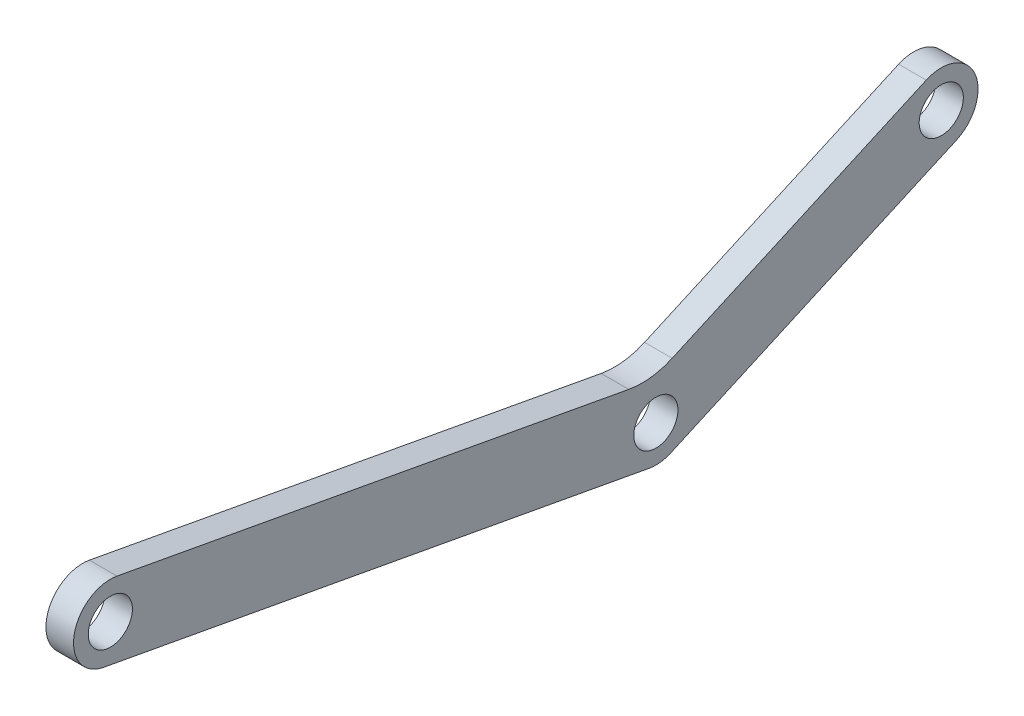
ISO-10303-21;
HEADER;
FILE_DESCRIPTION(('STEP AP214'),'2;1');
FILE_NAME('part.step','',(''),(''),'','','');
FILE_SCHEMA(('AUTOMOTIVE_DESIGN { 1 0 10303 214 1 1 1 1 }'));
ENDSEC;
DATA;
#1=APPLICATION_CONTEXT('core data for automotive mechanical design processes');
#2=APPLICATION_PROTOCOL_DEFINITION('international standard','automotive_design',2000,#1);
#3=PRODUCT_CONTEXT('',#1,'mechanical');
#4=PRODUCT('Part','Part','',(#3));
#5=PRODUCT_RELATED_PRODUCT_CATEGORY('part','',(#4));
#6=PRODUCT_DEFINITION_FORMATION('','',#4);
#7=PRODUCT_DEFINITION_CONTEXT('part definition',#1,'design');
#8=PRODUCT_DEFINITION('design','',#6,#7);
#9=PRODUCT_DEFINITION_SHAPE('','',#8);
#10=(LENGTH_UNIT() NAMED_UNIT(*) SI_UNIT(.MILLI.,.METRE.));
#11=(NAMED_UNIT(*) PLANE_ANGLE_UNIT() SI_UNIT($,.RADIAN.));
#12=(NAMED_UNIT(*) SI_UNIT($,.STERADIAN.) SOLID_ANGLE_UNIT());
#13=UNCERTAINTY_MEASURE_WITH_UNIT(LENGTH_MEASURE(1.E-05),#10,'distance_accuracy_value','');
#14=(GEOMETRIC_REPRESENTATION_CONTEXT(3) GLOBAL_UNCERTAINTY_ASSIGNED_CONTEXT((#13)) GLOBAL_UNIT_ASSIGNED_CONTEXT((#10,
#11,#12)) REPRESENTATION_CONTEXT('',''));
#15=CARTESIAN_POINT('',(0.,0.,0.));
#16=DIRECTION('',(0.,0.,1.));
#17=DIRECTION('',(1.,0.,0.));
#18=AXIS2_PLACEMENT_3D('',#15,#16,#17);
#19=CARTESIAN_POINT('',(-773.875,-73.65,551.64938766));
#20=DIRECTION('',(1.,0.,0.));
#21=DIRECTION('',(0.,0.,-1.));
#22=AXIS2_PLACEMENT_3D('',#19,#20,#21);
#23=PLANE('',#22);
#24=CARTESIAN_POINT('',(-773.875,-128.224072417712,255.133501715319));
#25=DIRECTION('',(1.,0.,0.));
#26=DIRECTION('',(0.,0.,-1.));
#27=AXIS2_PLACEMENT_3D('',#24,#25,#26);
#28=CIRCLE('',#27,12.);
#29=CARTESIAN_POINT('',(-773.875,-128.224072417712,243.133501715318));
#30=VERTEX_POINT('',#29);
#31=EDGE_CURVE('E188',#30,#30,#28,.T.);
#32=ORIENTED_EDGE('',*,*,#31,.F.);
#33=EDGE_LOOP('',(#32));
#34=FACE_BOUND('',#33,.T.);
#35=CARTESIAN_POINT('',(-773.875,-73.65,551.64938766));
#36=DIRECTION('',(1.,0.,0.));
#37=DIRECTION('',(0.,0.,-1.));
#38=AXIS2_PLACEMENT_3D('',#35,#36,#37);
#39=CIRCLE('',#38,20.);
#40=CARTESIAN_POINT('',(-773.875,-53.9803777328953,548.029172214834));
#41=VERTEX_POINT('',#40);
#42=CARTESIAN_POINT('',(-773.875,-93.3196222671047,555.269603105166));
#43=VERTEX_POINT('',#42);
#44=EDGE_CURVE('E151',#41,#43,#39,.T.);
#45=ORIENTED_EDGE('',*,*,#44,.T.);
#46=DIRECTION('',(0.,-0.1810107722583,-0.983481113355236));
#47=VECTOR('',#46,1.);
#48=CARTESIAN_POINT('',(-773.875,-93.3196222671047,555.269603105166));
#49=LINE('',#48,#47);
#50=CARTESIAN_POINT('',(-773.875,-147.893694684817,258.753717160484));
#51=VERTEX_POINT('',#50);
#52=EDGE_CURVE('E99',#43,#51,#49,.T.);
#53=ORIENTED_EDGE('',*,*,#52,.T.);
#54=CARTESIAN_POINT('',(-773.875,-128.224072417712,255.133501715319));
#55=DIRECTION('',(1.,0.,0.));
#56=DIRECTION('',(0.,0.,-1.));
#57=AXIS2_PLACEMENT_3D('',#54,#55,#56);
#58=CIRCLE('',#57,20.);
#59=CARTESIAN_POINT('',(-773.875,-146.475072619514,246.954199077941));
#60=VERTEX_POINT('',#59);
#61=EDGE_CURVE('E166',#51,#60,#58,.T.);
#62=ORIENTED_EDGE('',*,*,#61,.T.);
#63=DIRECTION('',(0.,0.408965131868894,-0.912550010090109));
#64=VECTOR('',#63,1.);
#65=CARTESIAN_POINT('',(-773.875,-76.9510002018022,91.8206973626221));
#66=LINE('',#65,#64);
#67=CARTESIAN_POINT('',(-773.875,-76.9510002018022,91.8206973626221));
#68=VERTEX_POINT('',#67);
#69=EDGE_CURVE('E179',#60,#68,#66,.T.);
#70=ORIENTED_EDGE('',*,*,#69,.T.);
#71=CARTESIAN_POINT('',(-773.875,-58.7,100.));
#72=DIRECTION('',(1.,0.,0.));
#73=DIRECTION('',(0.,0.,-1.));
#74=AXIS2_PLACEMENT_3D('',#71,#72,#73);
#75=CIRCLE('',#74,20.);
#76=CARTESIAN_POINT('',(-773.875,-40.4489997981978,108.179302637378));
#77=VERTEX_POINT('',#76);
#78=EDGE_CURVE('E118',#68,#77,#75,.T.);
#79=ORIENTED_EDGE('',*,*,#78,.T.);
#80=DIRECTION('',(0.,-0.408965131868895,0.912550010090109));
#81=VECTOR('',#80,1.);
#82=CARTESIAN_POINT('',(-773.875,-102.337768012915,246.275662590407));
#83=LINE('',#82,#81);
#84=CARTESIAN_POINT('',(-773.875,-102.337768012915,246.275662590407));
#85=VERTEX_POINT('',#84);
#86=EDGE_CURVE('E112',#77,#85,#83,.T.);
#87=ORIENTED_EDGE('',*,*,#86,.T.);
#88=CARTESIAN_POINT('',(-773.875,-65.8357676093109,262.634267865163));
#89=DIRECTION('',(-1.,0.,0.));
#90=DIRECTION('',(0.,0.,-1.));
#91=AXIS2_PLACEMENT_3D('',#88,#89,#90);
#92=CIRCLE('',#91,40.);
#93=CARTESIAN_POINT('',(-773.875,-105.17501214352,269.874698755495));
#94=VERTEX_POINT('',#93);
#95=EDGE_CURVE('E116',#85,#94,#92,.T.);
#96=ORIENTED_EDGE('',*,*,#95,.T.);
#97=DIRECTION('',(0.,0.1810107722583,0.983481113355236));
#98=VECTOR('',#97,1.);
#99=CARTESIAN_POINT('',(-773.875,-53.9803777328953,548.029172214834));
#100=LINE('',#99,#98);
#101=EDGE_CURVE('E56',#94,#41,#100,.T.);
#102=ORIENTED_EDGE('',*,*,#101,.T.);
#103=EDGE_LOOP('',(#45,#53,#62,#70,#79,#87,#96,#102));
#104=FACE_BOUND('',#103,.T.);
#105=CARTESIAN_POINT('',(-773.875,-58.7,100.));
#106=DIRECTION('',(1.,0.,0.));
#107=DIRECTION('',(0.,0.,-1.));
#108=AXIS2_PLACEMENT_3D('',#105,#106,#107);
#109=CIRCLE('',#108,12.);
#110=CARTESIAN_POINT('',(-773.875,-58.7,88.));
#111=VERTEX_POINT('',#110);
#112=EDGE_CURVE('E140',#111,#111,#109,.T.);
#113=ORIENTED_EDGE('',*,*,#112,.F.);
#114=EDGE_LOOP('',(#113));
#115=FACE_BOUND('',#114,.T.);
#116=CARTESIAN_POINT('',(-773.875,-73.65,551.64938766));
#117=DIRECTION('',(1.,0.,0.));
#118=DIRECTION('',(0.,0.,-1.));
#119=AXIS2_PLACEMENT_3D('',#116,#117,#118);
#120=CIRCLE('',#119,12.0000000000001);
#121=CARTESIAN_POINT('',(-773.875,-73.65,539.64938766));
#122=VERTEX_POINT('',#121);
#123=EDGE_CURVE('E194',#122,#122,#120,.T.);
#124=ORIENTED_EDGE('',*,*,#123,.F.);
#125=EDGE_LOOP('',(#124));
#126=FACE_BOUND('',#125,.T.);
#127=ADVANCED_FACE('F39',(#34,#104,#115,#126),#23,.T.);
#128=CARTESIAN_POINT('',(-788.875,-73.65,551.64938766));
#129=DIRECTION('',(1.,0.,0.));
#130=DIRECTION('',(0.,0.,-1.));
#131=AXIS2_PLACEMENT_3D('',#128,#129,#130);
#132=PLANE('',#131);
#133=CARTESIAN_POINT('',(-788.875,-73.65,551.64938766));
#134=DIRECTION('',(1.,0.,0.));
#135=DIRECTION('',(0.,0.,-1.));
#136=AXIS2_PLACEMENT_3D('',#133,#134,#135);
#137=CIRCLE('',#136,20.);
#138=CARTESIAN_POINT('',(-788.875,-53.9803777328953,548.029172214834));
#139=VERTEX_POINT('',#138);
#140=CARTESIAN_POINT('',(-788.875,-93.3196222671047,555.269603105166));
#141=VERTEX_POINT('',#140);
#142=EDGE_CURVE('E136',#139,#141,#137,.T.);
#143=ORIENTED_EDGE('',*,*,#142,.F.);
#144=DIRECTION('',(0.,0.1810107722583,0.983481113355236));
#145=VECTOR('',#144,1.);
#146=CARTESIAN_POINT('',(-788.875,-53.9803777328953,548.029172214834));
#147=LINE('',#146,#145);
#148=CARTESIAN_POINT('',(-788.875,-105.17501214352,269.874698755495));
#149=VERTEX_POINT('',#148);
#150=EDGE_CURVE('E91',#149,#139,#147,.T.);
#151=ORIENTED_EDGE('',*,*,#150,.F.);
#152=CARTESIAN_POINT('',(-788.875,-65.8357676093109,262.634267865163));
#153=DIRECTION('',(-1.,0.,0.));
#154=DIRECTION('',(0.,0.,-1.));
#155=AXIS2_PLACEMENT_3D('',#152,#153,#154);
#156=CIRCLE('',#155,40.);
#157=CARTESIAN_POINT('',(-788.875,-102.337768012915,246.275662590407));
#158=VERTEX_POINT('',#157);
#159=EDGE_CURVE('E85',#158,#149,#156,.T.);
#160=ORIENTED_EDGE('',*,*,#159,.F.);
#161=DIRECTION('',(0.,-0.408965131868895,0.912550010090109));
#162=VECTOR('',#161,1.);
#163=CARTESIAN_POINT('',(-788.875,-102.337768012915,246.275662590407));
#164=LINE('',#163,#162);
#165=CARTESIAN_POINT('',(-788.875,-40.4489997981978,108.179302637378));
#166=VERTEX_POINT('',#165);
#167=EDGE_CURVE('E126',#166,#158,#164,.T.);
#168=ORIENTED_EDGE('',*,*,#167,.F.);
#169=CARTESIAN_POINT('',(-788.875,-58.7,100.));
#170=DIRECTION('',(1.,0.,0.));
#171=DIRECTION('',(0.,0.,-1.));
#172=AXIS2_PLACEMENT_3D('',#169,#170,#171);
#173=CIRCLE('',#172,20.);
#174=CARTESIAN_POINT('',(-788.875,-76.9510002018022,91.8206973626221));
#175=VERTEX_POINT('',#174);
#176=EDGE_CURVE('E146',#175,#166,#173,.T.);
#177=ORIENTED_EDGE('',*,*,#176,.F.);
#178=DIRECTION('',(0.,0.408965131868894,-0.912550010090109));
#179=VECTOR('',#178,1.);
#180=CARTESIAN_POINT('',(-788.875,-76.9510002018022,91.8206973626221));
#181=LINE('',#180,#179);
#182=CARTESIAN_POINT('',(-788.875,-146.475072619514,246.954199077941));
#183=VERTEX_POINT('',#182);
#184=EDGE_CURVE('E144',#183,#175,#181,.T.);
#185=ORIENTED_EDGE('',*,*,#184,.F.);
#186=CARTESIAN_POINT('',(-788.875,-128.224072417712,255.133501715319));
#187=DIRECTION('',(1.,0.,0.));
#188=DIRECTION('',(0.,0.,-1.));
#189=AXIS2_PLACEMENT_3D('',#186,#187,#188);
#190=CIRCLE('',#189,20.);
#191=CARTESIAN_POINT('',(-788.875,-147.893694684817,258.753717160484));
#192=VERTEX_POINT('',#191);
#193=EDGE_CURVE('E142',#192,#183,#190,.T.);
#194=ORIENTED_EDGE('',*,*,#193,.F.);
#195=DIRECTION('',(0.,-0.1810107722583,-0.983481113355236));
#196=VECTOR('',#195,1.);
#197=CARTESIAN_POINT('',(-788.875,-93.3196222671047,555.269603105166));
#198=LINE('',#197,#196);
#199=EDGE_CURVE('E139',#141,#192,#198,.T.);
#200=ORIENTED_EDGE('',*,*,#199,.F.);
#201=EDGE_LOOP('',(#143,#151,#160,#168,#177,#185,#194,#200));
#202=FACE_BOUND('',#201,.T.);
#203=CARTESIAN_POINT('',(-788.875,-58.7,100.));
#204=DIRECTION('',(1.,0.,0.));
#205=DIRECTION('',(0.,0.,-1.));
#206=AXIS2_PLACEMENT_3D('',#203,#204,#205);
#207=CIRCLE('',#206,12.);
#208=CARTESIAN_POINT('',(-788.875,-58.7,88.));
#209=VERTEX_POINT('',#208);
#210=EDGE_CURVE('E185',#209,#209,#207,.T.);
#211=ORIENTED_EDGE('',*,*,#210,.T.);
#212=EDGE_LOOP('',(#211));
#213=FACE_BOUND('',#212,.T.);
#214=CARTESIAN_POINT('',(-788.875,-128.224072417712,255.133501715319));
#215=DIRECTION('',(1.,0.,0.));
#216=DIRECTION('',(0.,0.,-1.));
#217=AXIS2_PLACEMENT_3D('',#214,#215,#216);
#218=CIRCLE('',#217,12.);
#219=CARTESIAN_POINT('',(-788.875,-128.224072417712,243.133501715318));
#220=VERTEX_POINT('',#219);
#221=EDGE_CURVE('E191',#220,#220,#218,.T.);
#222=ORIENTED_EDGE('',*,*,#221,.T.);
#223=EDGE_LOOP('',(#222));
#224=FACE_BOUND('',#223,.T.);
#225=CARTESIAN_POINT('',(-788.875,-73.65,551.64938766));
#226=DIRECTION('',(1.,0.,0.));
#227=DIRECTION('',(0.,0.,-1.));
#228=AXIS2_PLACEMENT_3D('',#225,#226,#227);
#229=CIRCLE('',#228,12.0000000000001);
#230=CARTESIAN_POINT('',(-788.875,-73.65,539.64938766));
#231=VERTEX_POINT('',#230);
#232=EDGE_CURVE('E197',#231,#231,#229,.T.);
#233=ORIENTED_EDGE('',*,*,#232,.T.);
#234=EDGE_LOOP('',(#233));
#235=FACE_BOUND('',#234,.T.);
#236=ADVANCED_FACE('F170',(#202,#213,#224,#235),#132,.F.);
#237=CARTESIAN_POINT('',(-773.875,-73.65,551.64938766));
#238=DIRECTION('',(-1.,0.,0.));
#239=DIRECTION('',(0.,0.,1.));
#240=AXIS2_PLACEMENT_3D('',#237,#238,#239);
#241=CYLINDRICAL_SURFACE('',#240,20.);
#242=ORIENTED_EDGE('',*,*,#142,.T.);
#243=DIRECTION('',(-1.,0.,0.));
#244=VECTOR('',#243,1.);
#245=CARTESIAN_POINT('',(-773.875,-93.3196222671047,555.269603105166));
#246=LINE('',#245,#244);
#247=EDGE_CURVE('E11',#43,#141,#246,.T.);
#248=ORIENTED_EDGE('',*,*,#247,.F.);
#249=ORIENTED_EDGE('',*,*,#44,.F.);
#250=DIRECTION('',(-1.,0.,0.));
#251=VECTOR('',#250,1.);
#252=CARTESIAN_POINT('',(-773.875,-53.9803777328953,548.029172214834));
#253=LINE('',#252,#251);
#254=EDGE_CURVE('E132',#41,#139,#253,.T.);
#255=ORIENTED_EDGE('',*,*,#254,.T.);
#256=EDGE_LOOP('',(#242,#248,#249,#255));
#257=FACE_BOUND('',#256,.T.);
#258=ADVANCED_FACE('F41',(#257),#241,.T.);
#259=CARTESIAN_POINT('',(-773.875,-93.3196222671047,555.269603105166));
#260=DIRECTION('',(0.,0.983481113355236,-0.1810107722583));
#261=DIRECTION('',(0.,0.1810107722583,0.983481113355236));
#262=AXIS2_PLACEMENT_3D('',#259,#260,#261);
#263=PLANE('',#262);
#264=ORIENTED_EDGE('',*,*,#199,.T.);
#265=DIRECTION('',(-1.,0.,0.));
#266=VECTOR('',#265,1.);
#267=CARTESIAN_POINT('',(-773.875,-147.893694684817,258.753717160484));
#268=LINE('',#267,#266);
#269=EDGE_CURVE('E48',#51,#192,#268,.T.);
#270=ORIENTED_EDGE('',*,*,#269,.F.);
#271=ORIENTED_EDGE('',*,*,#52,.F.);
#272=ORIENTED_EDGE('',*,*,#247,.T.);
#273=EDGE_LOOP('',(#264,#270,#271,#272));
#274=FACE_BOUND('',#273,.T.);
#275=ADVANCED_FACE('F230',(#274),#263,.F.);
#276=CARTESIAN_POINT('',(-773.875,-128.224072417712,255.133501715319));
#277=DIRECTION('',(-1.,0.,0.));
#278=DIRECTION('',(0.,0.,1.));
#279=AXIS2_PLACEMENT_3D('',#276,#277,#278);
#280=CYLINDRICAL_SURFACE('',#279,20.);
#281=ORIENTED_EDGE('',*,*,#193,.T.);
#282=DIRECTION('',(-1.,0.,0.));
#283=VECTOR('',#282,1.);
#284=CARTESIAN_POINT('',(-773.875,-146.475072619514,246.954199077941));
#285=LINE('',#284,#283);
#286=EDGE_CURVE('E158',#60,#183,#285,.T.);
#287=ORIENTED_EDGE('',*,*,#286,.F.);
#288=ORIENTED_EDGE('',*,*,#61,.F.);
#289=ORIENTED_EDGE('',*,*,#269,.T.);
#290=EDGE_LOOP('',(#281,#287,#288,#289));
#291=FACE_BOUND('',#290,.T.);
#292=ADVANCED_FACE('F164',(#291),#280,.T.);
#293=CARTESIAN_POINT('',(-773.875,-76.9510002018022,91.8206973626221));
#294=DIRECTION('',(0.,0.912550010090109,0.408965131868894));
#295=DIRECTION('',(0.,-0.408965131868894,0.912550010090109));
#296=AXIS2_PLACEMENT_3D('',#293,#294,#295);
#297=PLANE('',#296);
#298=ORIENTED_EDGE('',*,*,#184,.T.);
#299=DIRECTION('',(-1.,0.,0.));
#300=VECTOR('',#299,1.);
#301=CARTESIAN_POINT('',(-773.875,-76.9510002018022,91.8206973626221));
#302=LINE('',#301,#300);
#303=EDGE_CURVE('E155',#68,#175,#302,.T.);
#304=ORIENTED_EDGE('',*,*,#303,.F.);
#305=ORIENTED_EDGE('',*,*,#69,.F.);
#306=ORIENTED_EDGE('',*,*,#286,.T.);
#307=EDGE_LOOP('',(#298,#304,#305,#306));
#308=FACE_BOUND('',#307,.T.);
#309=ADVANCED_FACE('F175',(#308),#297,.F.);
#310=CARTESIAN_POINT('',(-773.875,-58.7,100.));
#311=DIRECTION('',(-1.,0.,0.));
#312=DIRECTION('',(0.,0.,1.));
#313=AXIS2_PLACEMENT_3D('',#310,#311,#312);
#314=CYLINDRICAL_SURFACE('',#313,20.);
#315=ORIENTED_EDGE('',*,*,#176,.T.);
#316=DIRECTION('',(-1.,0.,0.));
#317=VECTOR('',#316,1.);
#318=CARTESIAN_POINT('',(-773.875,-40.4489997981978,108.179302637378));
#319=LINE('',#318,#317);
#320=EDGE_CURVE('E127',#77,#166,#319,.T.);
#321=ORIENTED_EDGE('',*,*,#320,.F.);
#322=ORIENTED_EDGE('',*,*,#78,.F.);
#323=ORIENTED_EDGE('',*,*,#303,.T.);
#324=EDGE_LOOP('',(#315,#321,#322,#323));
#325=FACE_BOUND('',#324,.T.);
#326=ADVANCED_FACE('F178',(#325),#314,.T.);
#327=CARTESIAN_POINT('',(-773.875,-102.337768012915,246.275662590407));
#328=DIRECTION('',(0.,-0.912550010090109,-0.408965131868895));
#329=DIRECTION('',(0.,0.408965131868895,-0.912550010090109));
#330=AXIS2_PLACEMENT_3D('',#327,#328,#329);
#331=PLANE('',#330);
#332=ORIENTED_EDGE('',*,*,#167,.T.);
#333=DIRECTION('',(-1.,0.,0.));
#334=VECTOR('',#333,1.);
#335=CARTESIAN_POINT('',(-773.875,-102.337768012915,246.275662590407));
#336=LINE('',#335,#334);
#337=EDGE_CURVE('E123',#85,#158,#336,.T.);
#338=ORIENTED_EDGE('',*,*,#337,.F.);
#339=ORIENTED_EDGE('',*,*,#86,.F.);
#340=ORIENTED_EDGE('',*,*,#320,.T.);
#341=EDGE_LOOP('',(#332,#338,#339,#340));
#342=FACE_BOUND('',#341,.T.);
#343=ADVANCED_FACE('F124',(#342),#331,.F.);
#344=CARTESIAN_POINT('',(-773.875,-65.8357676093109,262.634267865163));
#345=DIRECTION('',(-1.,0.,0.));
#346=DIRECTION('',(0.,0.,1.));
#347=AXIS2_PLACEMENT_3D('',#344,#345,#346);
#348=CYLINDRICAL_SURFACE('',#347,40.);
#349=ORIENTED_EDGE('',*,*,#159,.T.);
#350=DIRECTION('',(-1.,0.,0.));
#351=VECTOR('',#350,1.);
#352=CARTESIAN_POINT('',(-773.875,-105.17501214352,269.874698755495));
#353=LINE('',#352,#351);
#354=EDGE_CURVE('E128',#94,#149,#353,.T.);
#355=ORIENTED_EDGE('',*,*,#354,.F.);
#356=ORIENTED_EDGE('',*,*,#95,.F.);
#357=ORIENTED_EDGE('',*,*,#337,.T.);
#358=EDGE_LOOP('',(#349,#355,#356,#357));
#359=FACE_BOUND('',#358,.T.);
#360=ADVANCED_FACE('F130',(#359),#348,.F.);
#361=CARTESIAN_POINT('',(-773.875,-53.9803777328953,548.029172214834));
#362=DIRECTION('',(0.,-0.983481113355236,0.1810107722583));
#363=DIRECTION('',(0.,-0.1810107722583,-0.983481113355236));
#364=AXIS2_PLACEMENT_3D('',#361,#362,#363);
#365=PLANE('',#364);
#366=ORIENTED_EDGE('',*,*,#150,.T.);
#367=ORIENTED_EDGE('',*,*,#254,.F.);
#368=ORIENTED_EDGE('',*,*,#101,.F.);
#369=ORIENTED_EDGE('',*,*,#354,.T.);
#370=EDGE_LOOP('',(#366,#367,#368,#369));
#371=FACE_BOUND('',#370,.T.);
#372=ADVANCED_FACE('F218',(#371),#365,.F.);
#373=CARTESIAN_POINT('',(-773.875,-58.7,100.));
#374=DIRECTION('',(-1.,0.,0.));
#375=DIRECTION('',(0.,0.,1.));
#376=AXIS2_PLACEMENT_3D('',#373,#374,#375);
#377=CYLINDRICAL_SURFACE('',#376,12.);
#378=ORIENTED_EDGE('',*,*,#112,.T.);
#379=EDGE_LOOP('',(#378));
#380=FACE_BOUND('',#379,.T.);
#381=ORIENTED_EDGE('',*,*,#210,.F.);
#382=EDGE_LOOP('',(#381));
#383=FACE_BOUND('',#382,.T.);
#384=ADVANCED_FACE('F215',(#380,#383),#377,.F.);
#385=CARTESIAN_POINT('',(-773.875,-128.224072417712,255.133501715319));
#386=DIRECTION('',(-1.,0.,0.));
#387=DIRECTION('',(0.,0.,1.));
#388=AXIS2_PLACEMENT_3D('',#385,#386,#387);
#389=CYLINDRICAL_SURFACE('',#388,12.);
#390=ORIENTED_EDGE('',*,*,#31,.T.);
#391=EDGE_LOOP('',(#390));
#392=FACE_BOUND('',#391,.T.);
#393=ORIENTED_EDGE('',*,*,#221,.F.);
#394=EDGE_LOOP('',(#393));
#395=FACE_BOUND('',#394,.T.);
#396=ADVANCED_FACE('F293',(#392,#395),#389,.F.);
#397=CARTESIAN_POINT('',(-773.875,-73.65,551.64938766));
#398=DIRECTION('',(-1.,0.,0.));
#399=DIRECTION('',(0.,0.,1.));
#400=AXIS2_PLACEMENT_3D('',#397,#398,#399);
#401=CYLINDRICAL_SURFACE('',#400,12.0000000000001);
#402=ORIENTED_EDGE('',*,*,#123,.T.);
#403=EDGE_LOOP('',(#402));
#404=FACE_BOUND('',#403,.T.);
#405=ORIENTED_EDGE('',*,*,#232,.F.);
#406=EDGE_LOOP('',(#405));
#407=FACE_BOUND('',#406,.T.);
#408=ADVANCED_FACE('F203',(#404,#407),#401,.F.);
#409=CLOSED_SHELL('',(#127,#236,#258,#275,#292,#309,#326,#343,#360,#372,#384,#396,#408));
#410=MANIFOLD_SOLID_BREP('B2',#409);
#411=ADVANCED_BREP_SHAPE_REPRESENTATION('',(#18,#410),#14);
#412=SHAPE_DEFINITION_REPRESENTATION(#9,#411);
ENDSEC;
END-ISO-10303-21;
